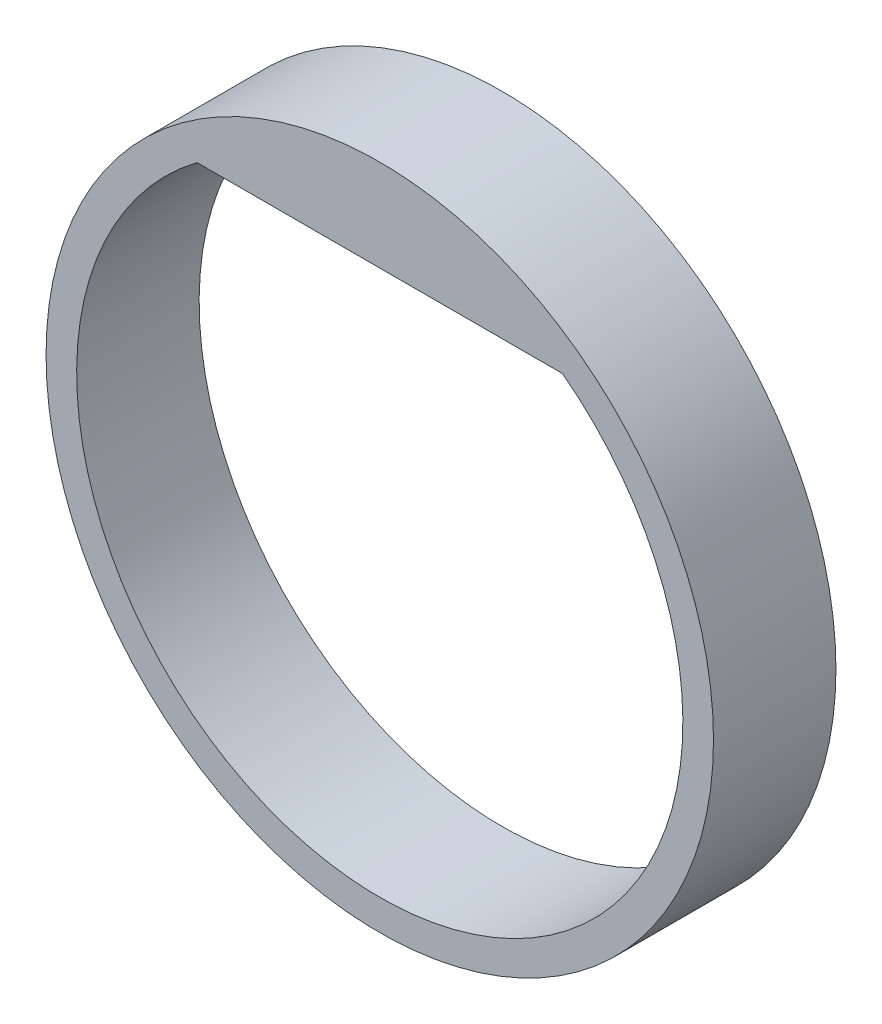
ISO-10303-21;
HEADER;
FILE_DESCRIPTION(('STEP AP214'),'2;1');
FILE_NAME('part.step','',(''),(''),'','','');
FILE_SCHEMA(('AUTOMOTIVE_DESIGN { 1 0 10303 214 1 1 1 1 }'));
ENDSEC;
DATA;
#1=APPLICATION_CONTEXT('core data for automotive mechanical design processes');
#2=APPLICATION_PROTOCOL_DEFINITION('international standard','automotive_design',2000,#1);
#3=PRODUCT_CONTEXT('',#1,'mechanical');
#4=PRODUCT('Part','Part','',(#3));
#5=PRODUCT_RELATED_PRODUCT_CATEGORY('part','',(#4));
#6=PRODUCT_DEFINITION_FORMATION('','',#4);
#7=PRODUCT_DEFINITION_CONTEXT('part definition',#1,'design');
#8=PRODUCT_DEFINITION('design','',#6,#7);
#9=PRODUCT_DEFINITION_SHAPE('','',#8);
#10=(LENGTH_UNIT() NAMED_UNIT(*) SI_UNIT(.MILLI.,.METRE.));
#11=(NAMED_UNIT(*) PLANE_ANGLE_UNIT() SI_UNIT($,.RADIAN.));
#12=(NAMED_UNIT(*) SI_UNIT($,.STERADIAN.) SOLID_ANGLE_UNIT());
#13=UNCERTAINTY_MEASURE_WITH_UNIT(LENGTH_MEASURE(1.E-05),#10,'distance_accuracy_value','');
#14=(GEOMETRIC_REPRESENTATION_CONTEXT(3) GLOBAL_UNCERTAINTY_ASSIGNED_CONTEXT((#13)) GLOBAL_UNIT_ASSIGNED_CONTEXT((#10,
#11,#12)) REPRESENTATION_CONTEXT('',''));
#15=CARTESIAN_POINT('',(0.,0.,0.));
#16=DIRECTION('',(0.,0.,1.));
#17=DIRECTION('',(1.,0.,0.));
#18=AXIS2_PLACEMENT_3D('',#15,#16,#17);
#19=CARTESIAN_POINT('',(0.,0.,2.));
#20=DIRECTION('',(0.,0.,1.));
#21=DIRECTION('',(1.,0.,0.));
#22=AXIS2_PLACEMENT_3D('',#19,#20,#21);
#23=PLANE('',#22);
#24=CARTESIAN_POINT('',(0.,0.,2.));
#25=DIRECTION('',(0.,0.,1.));
#26=DIRECTION('',(1.,0.,0.));
#27=AXIS2_PLACEMENT_3D('',#24,#25,#26);
#28=CIRCLE('',#27,5.45);
#29=CARTESIAN_POINT('',(5.45,0.,2.));
#30=VERTEX_POINT('',#29);
#31=EDGE_CURVE('E11',#30,#30,#28,.T.);
#32=ORIENTED_EDGE('',*,*,#31,.T.);
#33=EDGE_LOOP('',(#32));
#34=FACE_BOUND('',#33,.T.);
#35=DIRECTION('',(-1.,0.,0.));
#36=VECTOR('',#35,1.);
#37=CARTESIAN_POINT('',(2.98328677803526,3.95,2.));
#38=LINE('',#37,#36);
#39=CARTESIAN_POINT('',(2.98328677803526,3.95,2.));
#40=VERTEX_POINT('',#39);
#41=CARTESIAN_POINT('',(-2.98328677803526,3.95,2.));
#42=VERTEX_POINT('',#41);
#43=EDGE_CURVE('E82',#40,#42,#38,.T.);
#44=ORIENTED_EDGE('',*,*,#43,.F.);
#45=CARTESIAN_POINT('',(0.,0.,2.));
#46=DIRECTION('',(0.,0.,1.));
#47=DIRECTION('',(1.,0.,0.));
#48=AXIS2_PLACEMENT_3D('',#45,#46,#47);
#49=CIRCLE('',#48,4.95);
#50=EDGE_CURVE('E73',#42,#40,#49,.T.);
#51=ORIENTED_EDGE('',*,*,#50,.F.);
#52=EDGE_LOOP('',(#44,#51));
#53=FACE_BOUND('',#52,.T.);
#54=ADVANCED_FACE('F41',(#34,#53),#23,.T.);
#55=CARTESIAN_POINT('',(0.,0.,0.));
#56=DIRECTION('',(0.,0.,1.));
#57=DIRECTION('',(1.,0.,0.));
#58=AXIS2_PLACEMENT_3D('',#55,#56,#57);
#59=PLANE('',#58);
#60=CARTESIAN_POINT('',(0.,0.,0.));
#61=DIRECTION('',(0.,0.,1.));
#62=DIRECTION('',(1.,0.,0.));
#63=AXIS2_PLACEMENT_3D('',#60,#61,#62);
#64=CIRCLE('',#63,5.45);
#65=CARTESIAN_POINT('',(5.45,0.,0.));
#66=VERTEX_POINT('',#65);
#67=EDGE_CURVE('E45',#66,#66,#64,.T.);
#68=ORIENTED_EDGE('',*,*,#67,.F.);
#69=EDGE_LOOP('',(#68));
#70=FACE_BOUND('',#69,.T.);
#71=CARTESIAN_POINT('',(0.,0.,0.));
#72=DIRECTION('',(0.,0.,1.));
#73=DIRECTION('',(1.,0.,0.));
#74=AXIS2_PLACEMENT_3D('',#71,#72,#73);
#75=CIRCLE('',#74,4.95);
#76=CARTESIAN_POINT('',(-2.98328677803526,3.95,0.));
#77=VERTEX_POINT('',#76);
#78=CARTESIAN_POINT('',(2.98328677803526,3.95,0.));
#79=VERTEX_POINT('',#78);
#80=EDGE_CURVE('E63',#77,#79,#75,.T.);
#81=ORIENTED_EDGE('',*,*,#80,.T.);
#82=DIRECTION('',(-1.,0.,0.));
#83=VECTOR('',#82,1.);
#84=CARTESIAN_POINT('',(2.98328677803526,3.95,0.));
#85=LINE('',#84,#83);
#86=EDGE_CURVE('E69',#79,#77,#85,.T.);
#87=ORIENTED_EDGE('',*,*,#86,.T.);
#88=EDGE_LOOP('',(#81,#87));
#89=FACE_BOUND('',#88,.T.);
#90=ADVANCED_FACE('F79',(#70,#89),#59,.F.);
#91=CARTESIAN_POINT('',(0.,0.,2.));
#92=DIRECTION('',(0.,0.,-1.));
#93=DIRECTION('',(-1.,0.,0.));
#94=AXIS2_PLACEMENT_3D('',#91,#92,#93);
#95=CYLINDRICAL_SURFACE('',#94,5.45);
#96=ORIENTED_EDGE('',*,*,#31,.F.);
#97=EDGE_LOOP('',(#96));
#98=FACE_BOUND('',#97,.T.);
#99=ORIENTED_EDGE('',*,*,#67,.T.);
#100=EDGE_LOOP('',(#99));
#101=FACE_BOUND('',#100,.T.);
#102=ADVANCED_FACE('F43',(#98,#101),#95,.T.);
#103=CARTESIAN_POINT('',(0.,0.,2.));
#104=DIRECTION('',(0.,0.,-1.));
#105=DIRECTION('',(-1.,0.,0.));
#106=AXIS2_PLACEMENT_3D('',#103,#104,#105);
#107=CYLINDRICAL_SURFACE('',#106,4.95);
#108=ORIENTED_EDGE('',*,*,#80,.F.);
#109=DIRECTION('',(0.,0.,-1.));
#110=VECTOR('',#109,1.);
#111=CARTESIAN_POINT('',(-2.98328677803526,3.95,2.));
#112=LINE('',#111,#110);
#113=EDGE_CURVE('E71',#42,#77,#112,.T.);
#114=ORIENTED_EDGE('',*,*,#113,.F.);
#115=ORIENTED_EDGE('',*,*,#50,.T.);
#116=DIRECTION('',(0.,0.,-1.));
#117=VECTOR('',#116,1.);
#118=CARTESIAN_POINT('',(2.98328677803526,3.95,2.));
#119=LINE('',#118,#117);
#120=EDGE_CURVE('E56',#40,#79,#119,.T.);
#121=ORIENTED_EDGE('',*,*,#120,.T.);
#122=EDGE_LOOP('',(#108,#114,#115,#121));
#123=FACE_BOUND('',#122,.T.);
#124=ADVANCED_FACE('F75',(#123),#107,.F.);
#125=CARTESIAN_POINT('',(2.98328677803526,3.95,2.));
#126=DIRECTION('',(0.,-1.,0.));
#127=DIRECTION('',(0.,0.,-1.));
#128=AXIS2_PLACEMENT_3D('',#125,#126,#127);
#129=PLANE('',#128);
#130=ORIENTED_EDGE('',*,*,#86,.F.);
#131=ORIENTED_EDGE('',*,*,#120,.F.);
#132=ORIENTED_EDGE('',*,*,#43,.T.);
#133=ORIENTED_EDGE('',*,*,#113,.T.);
#134=EDGE_LOOP('',(#130,#131,#132,#133));
#135=FACE_BOUND('',#134,.T.);
#136=ADVANCED_FACE('F70',(#135),#129,.T.);
#137=CLOSED_SHELL('',(#54,#90,#102,#124,#136));
#138=MANIFOLD_SOLID_BREP('B2',#137);
#139=ADVANCED_BREP_SHAPE_REPRESENTATION('',(#18,#138),#14);
#140=SHAPE_DEFINITION_REPRESENTATION(#9,#139);
ENDSEC;
END-ISO-10303-21;
